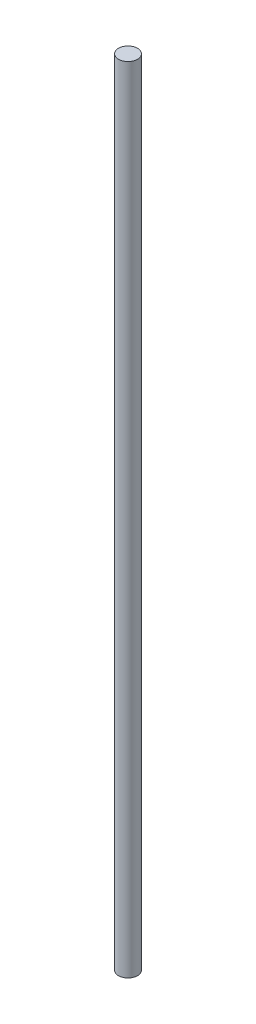
ISO-10303-21;
HEADER;
FILE_DESCRIPTION(('STEP AP214'),'2;1');
FILE_NAME('part.step','',(''),(''),'','','');
FILE_SCHEMA(('AUTOMOTIVE_DESIGN { 1 0 10303 214 1 1 1 1 }'));
ENDSEC;
DATA;
#1=APPLICATION_CONTEXT('core data for automotive mechanical design processes');
#2=APPLICATION_PROTOCOL_DEFINITION('international standard','automotive_design',2000,#1);
#3=PRODUCT_CONTEXT('',#1,'mechanical');
#4=PRODUCT('Part','Part','',(#3));
#5=PRODUCT_RELATED_PRODUCT_CATEGORY('part','',(#4));
#6=PRODUCT_DEFINITION_FORMATION('','',#4);
#7=PRODUCT_DEFINITION_CONTEXT('part definition',#1,'design');
#8=PRODUCT_DEFINITION('design','',#6,#7);
#9=PRODUCT_DEFINITION_SHAPE('','',#8);
#10=(LENGTH_UNIT() NAMED_UNIT(*) SI_UNIT(.MILLI.,.METRE.));
#11=(NAMED_UNIT(*) PLANE_ANGLE_UNIT() SI_UNIT($,.RADIAN.));
#12=(NAMED_UNIT(*) SI_UNIT($,.STERADIAN.) SOLID_ANGLE_UNIT());
#13=UNCERTAINTY_MEASURE_WITH_UNIT(LENGTH_MEASURE(1.E-05),#10,'distance_accuracy_value','');
#14=(GEOMETRIC_REPRESENTATION_CONTEXT(3) GLOBAL_UNCERTAINTY_ASSIGNED_CONTEXT((#13)) GLOBAL_UNIT_ASSIGNED_CONTEXT((#10,
#11,#12)) REPRESENTATION_CONTEXT('',''));
#15=CARTESIAN_POINT('',(0.,0.,0.));
#16=DIRECTION('',(0.,0.,1.));
#17=DIRECTION('',(1.,0.,0.));
#18=AXIS2_PLACEMENT_3D('',#15,#16,#17);
#19=CARTESIAN_POINT('',(0.,0.,0.));
#20=DIRECTION('',(0.,-1.,0.));
#21=DIRECTION('',(0.,0.,-1.));
#22=AXIS2_PLACEMENT_3D('',#19,#20,#21);
#23=PLANE('',#22);
#24=CARTESIAN_POINT('',(0.,0.,0.));
#25=DIRECTION('',(0.,-1.,0.));
#26=DIRECTION('',(0.,0.,-1.));
#27=AXIS2_PLACEMENT_3D('',#24,#25,#26);
#28=CIRCLE('',#27,12.);
#29=CARTESIAN_POINT('',(0.,0.,-12.));
#30=VERTEX_POINT('',#29);
#31=EDGE_CURVE('E26',#30,#30,#28,.T.);
#32=ORIENTED_EDGE('',*,*,#31,.F.);
#33=EDGE_LOOP('',(#32));
#34=FACE_BOUND('',#33,.T.);
#35=ADVANCED_FACE('F17',(#34),#23,.F.);
#36=CARTESIAN_POINT('',(0.,-1000.,0.));
#37=DIRECTION('',(0.,-1.,0.));
#38=DIRECTION('',(0.,0.,-1.));
#39=AXIS2_PLACEMENT_3D('',#36,#37,#38);
#40=CYLINDRICAL_SURFACE('',#39,12.);
#41=CARTESIAN_POINT('',(0.,-1000.,0.));
#42=DIRECTION('',(0.,-1.,0.));
#43=DIRECTION('',(0.,0.,-1.));
#44=AXIS2_PLACEMENT_3D('',#41,#42,#43);
#45=CIRCLE('',#44,12.);
#46=CARTESIAN_POINT('',(0.,-1000.,-12.));
#47=VERTEX_POINT('',#46);
#48=EDGE_CURVE('E11',#47,#47,#45,.T.);
#49=ORIENTED_EDGE('',*,*,#48,.F.);
#50=EDGE_LOOP('',(#49));
#51=FACE_BOUND('',#50,.T.);
#52=ORIENTED_EDGE('',*,*,#31,.T.);
#53=EDGE_LOOP('',(#52));
#54=FACE_BOUND('',#53,.T.);
#55=ADVANCED_FACE('F35',(#51,#54),#40,.T.);
#56=CARTESIAN_POINT('',(12.,-1000.,0.));
#57=DIRECTION('',(0.,1.,0.));
#58=DIRECTION('',(0.,0.,1.));
#59=AXIS2_PLACEMENT_3D('',#56,#57,#58);
#60=PLANE('',#59);
#61=ORIENTED_EDGE('',*,*,#48,.T.);
#62=EDGE_LOOP('',(#61));
#63=FACE_BOUND('',#62,.T.);
#64=ADVANCED_FACE('F19',(#63),#60,.F.);
#65=CLOSED_SHELL('',(#35,#55,#64));
#66=MANIFOLD_SOLID_BREP('B1',#65);
#67=ADVANCED_BREP_SHAPE_REPRESENTATION('',(#18,#66),#14);
#68=SHAPE_DEFINITION_REPRESENTATION(#9,#67);
ENDSEC;
END-ISO-10303-21;
